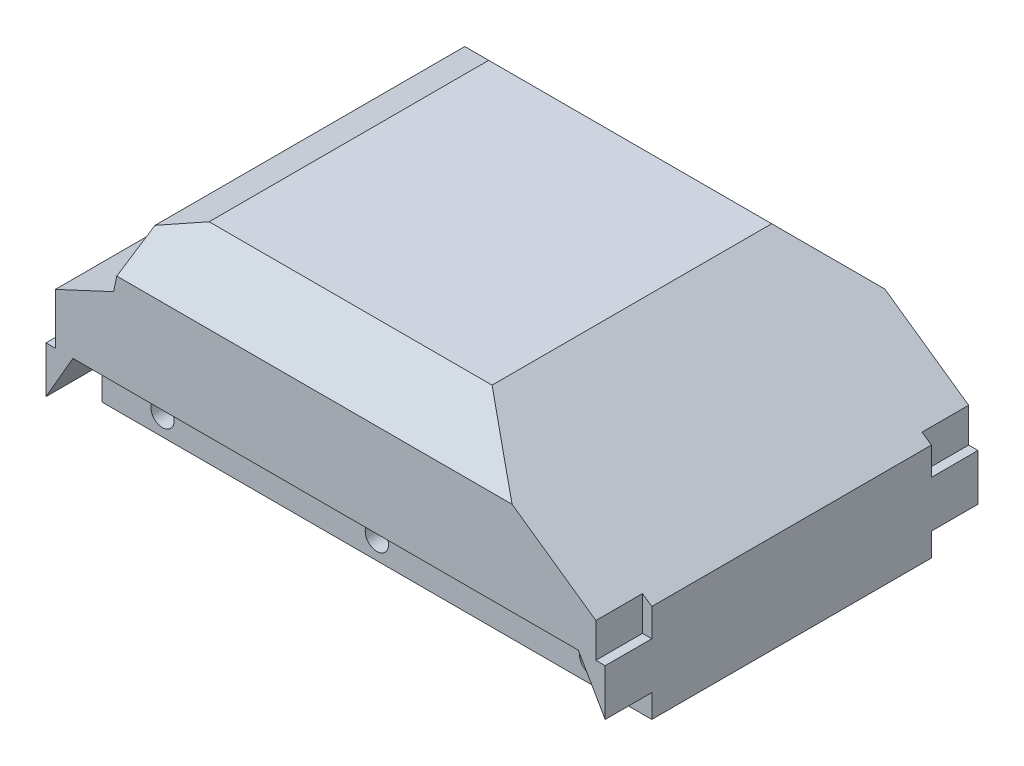
ISO-10303-21;
HEADER;
FILE_DESCRIPTION(('STEP AP214'),'2;1');
FILE_NAME('part.step','',(''),(''),'','','');
FILE_SCHEMA(('AUTOMOTIVE_DESIGN { 1 0 10303 214 1 1 1 1 }'));
ENDSEC;
DATA;
#1=APPLICATION_CONTEXT('core data for automotive mechanical design processes');
#2=APPLICATION_PROTOCOL_DEFINITION('international standard','automotive_design',2000,#1);
#3=PRODUCT_CONTEXT('',#1,'mechanical');
#4=PRODUCT('Part','Part','',(#3));
#5=PRODUCT_RELATED_PRODUCT_CATEGORY('part','',(#4));
#6=PRODUCT_DEFINITION_FORMATION('','',#4);
#7=PRODUCT_DEFINITION_CONTEXT('part definition',#1,'design');
#8=PRODUCT_DEFINITION('design','',#6,#7);
#9=PRODUCT_DEFINITION_SHAPE('','',#8);
#10=(LENGTH_UNIT() NAMED_UNIT(*) SI_UNIT(.MILLI.,.METRE.));
#11=(NAMED_UNIT(*) PLANE_ANGLE_UNIT() SI_UNIT($,.RADIAN.));
#12=(NAMED_UNIT(*) SI_UNIT($,.STERADIAN.) SOLID_ANGLE_UNIT());
#13=UNCERTAINTY_MEASURE_WITH_UNIT(LENGTH_MEASURE(1.E-05),#10,'distance_accuracy_value','');
#14=(GEOMETRIC_REPRESENTATION_CONTEXT(3) GLOBAL_UNCERTAINTY_ASSIGNED_CONTEXT((#13)) GLOBAL_UNIT_ASSIGNED_CONTEXT((#10,
#11,#12)) REPRESENTATION_CONTEXT('',''));
#15=CARTESIAN_POINT('',(0.,0.,0.));
#16=DIRECTION('',(0.,0.,1.));
#17=DIRECTION('',(1.,0.,0.));
#18=AXIS2_PLACEMENT_3D('',#15,#16,#17);
#19=CARTESIAN_POINT('',(0.,74.8916505008483,0.));
#20=DIRECTION('',(0.,-1.,0.));
#21=DIRECTION('',(0.,0.,-1.));
#22=AXIS2_PLACEMENT_3D('',#19,#20,#21);
#23=PLANE('',#22);
#24=DIRECTION('',(0.,0.,-1.));
#25=VECTOR('',#24,1.);
#26=CARTESIAN_POINT('',(113.092371629918,74.8916505008483,195.747597125653));
#27=LINE('',#26,#25);
#28=CARTESIAN_POINT('',(113.092371629918,74.8916505008483,92.1829002882369));
#29=VERTEX_POINT('',#28);
#30=CARTESIAN_POINT('',(113.092371629918,74.8916505008483,79.4829002882369));
#31=VERTEX_POINT('',#30);
#32=EDGE_CURVE('E305',#29,#31,#27,.T.);
#33=ORIENTED_EDGE('',*,*,#32,.F.);
#34=DIRECTION('',(1.,0.,0.));
#35=VECTOR('',#34,1.);
#36=CARTESIAN_POINT('',(-29.4352799513737,74.8916505008483,92.1829002882369));
#37=LINE('',#36,#35);
#38=CARTESIAN_POINT('',(-24.6429315326656,74.8916505008483,92.1829002882369));
#39=VERTEX_POINT('',#38);
#40=EDGE_CURVE('E473',#39,#29,#37,.T.);
#41=ORIENTED_EDGE('',*,*,#40,.F.);
#42=DIRECTION('',(0.,0.,-1.));
#43=VECTOR('',#42,1.);
#44=CARTESIAN_POINT('',(-24.6429315326656,74.8916505008483,195.747597125653));
#45=LINE('',#44,#43);
#46=CARTESIAN_POINT('',(-24.6429315326656,74.8916505008483,79.4829002882369));
#47=VERTEX_POINT('',#46);
#48=EDGE_CURVE('E318',#39,#47,#45,.T.);
#49=ORIENTED_EDGE('',*,*,#48,.T.);
#50=DIRECTION('',(-1.,0.,0.));
#51=VECTOR('',#50,1.);
#52=CARTESIAN_POINT('',(-29.4352799513737,74.8916505008483,79.4829002882369));
#53=LINE('',#52,#51);
#54=EDGE_CURVE('E405',#31,#47,#53,.T.);
#55=ORIENTED_EDGE('',*,*,#54,.F.);
#56=EDGE_LOOP('',(#33,#41,#49,#55));
#57=FACE_BOUND('',#56,.T.);
#58=ADVANCED_FACE('F33',(#57),#23,.T.);
#59=CARTESIAN_POINT('',(-24.6429315326656,74.8916505008483,181.082900288237));
#60=VERTEX_POINT('',#59);
#61=CARTESIAN_POINT('',(-24.6429315326656,74.8916505008483,168.382900288237));
#62=VERTEX_POINT('',#61);
#63=EDGE_CURVE('E327',#60,#62,#45,.T.);
#64=ORIENTED_EDGE('',*,*,#63,.T.);
#65=DIRECTION('',(-1.,0.,0.));
#66=VECTOR('',#65,1.);
#67=CARTESIAN_POINT('',(-29.4352799513737,74.8916505008483,168.382900288237));
#68=LINE('',#67,#66);
#69=CARTESIAN_POINT('',(113.092371629918,74.8916505008483,168.382900288237));
#70=VERTEX_POINT('',#69);
#71=EDGE_CURVE('E250',#70,#62,#68,.T.);
#72=ORIENTED_EDGE('',*,*,#71,.F.);
#73=CARTESIAN_POINT('',(113.092371629918,74.8916505008483,181.082900288237));
#74=VERTEX_POINT('',#73);
#75=EDGE_CURVE('E306',#74,#70,#27,.T.);
#76=ORIENTED_EDGE('',*,*,#75,.F.);
#77=DIRECTION('',(1.,0.,0.));
#78=VECTOR('',#77,1.);
#79=CARTESIAN_POINT('',(117.884720048626,74.8916505008483,181.082900288237));
#80=LINE('',#79,#78);
#81=EDGE_CURVE('E390',#60,#74,#80,.T.);
#82=ORIENTED_EDGE('',*,*,#81,.F.);
#83=EDGE_LOOP('',(#64,#72,#76,#82));
#84=FACE_BOUND('',#83,.T.);
#85=ADVANCED_FACE('F499',(#84),#23,.T.);
#86=CARTESIAN_POINT('',(-31.9752799513737,62.1916505008483,195.747597125653));
#87=DIRECTION('',(-0.866025403784442,0.499999999999995,0.));
#88=DIRECTION('',(-0.499999999999995,-0.866025403784442,0.));
#89=AXIS2_PLACEMENT_3D('',#86,#87,#88);
#90=PLANE('',#89);
#91=DIRECTION('',(0.499999999999995,0.866025403784442,0.));
#92=VECTOR('',#91,1.);
#93=CARTESIAN_POINT('',(-31.9752799513737,62.1916505008483,92.1829002882369));
#94=LINE('',#93,#92);
#95=CARTESIAN_POINT('',(-29.4352799513737,66.5910595520733,92.1829002882369));
#96=VERTEX_POINT('',#95);
#97=EDGE_CURVE('E50',#96,#39,#94,.T.);
#98=ORIENTED_EDGE('',*,*,#97,.F.);
#99=DIRECTION('',(0.,0.,-1.));
#100=VECTOR('',#99,1.);
#101=CARTESIAN_POINT('',(-29.4352799513737,66.5910595520733,195.747597125653));
#102=LINE('',#101,#100);
#103=CARTESIAN_POINT('',(-29.4352799513737,66.5910595520733,168.382900288237));
#104=VERTEX_POINT('',#103);
#105=EDGE_CURVE('E54',#104,#96,#102,.T.);
#106=ORIENTED_EDGE('',*,*,#105,.F.);
#107=DIRECTION('',(-0.499999999999995,-0.866025403784442,0.));
#108=VECTOR('',#107,1.);
#109=CARTESIAN_POINT('',(-31.9752799513737,62.1916505008483,168.382900288237));
#110=LINE('',#109,#108);
#111=EDGE_CURVE('E253',#62,#104,#110,.T.);
#112=ORIENTED_EDGE('',*,*,#111,.F.);
#113=ORIENTED_EDGE('',*,*,#63,.F.);
#114=DIRECTION('',(-0.499999999999995,-0.866025403784442,0.));
#115=VECTOR('',#114,1.);
#116=CARTESIAN_POINT('',(-31.9752799513737,62.1916505008483,181.082900288237));
#117=LINE('',#116,#115);
#118=CARTESIAN_POINT('',(-31.9752799513737,62.1916505008483,181.082900288237));
#119=VERTEX_POINT('',#118);
#120=EDGE_CURVE('E323',#60,#119,#117,.T.);
#121=ORIENTED_EDGE('',*,*,#120,.T.);
#122=DIRECTION('',(0.,0.,-1.));
#123=VECTOR('',#122,1.);
#124=CARTESIAN_POINT('',(-31.9752799513737,62.1916505008483,195.747597125653));
#125=LINE('',#124,#123);
#126=CARTESIAN_POINT('',(-31.9752799513737,62.1916505008483,79.4829002882369));
#127=VERTEX_POINT('',#126);
#128=EDGE_CURVE('E330',#119,#127,#125,.T.);
#129=ORIENTED_EDGE('',*,*,#128,.T.);
#130=DIRECTION('',(-0.499999999999994,-0.866025403784442,0.));
#131=VECTOR('',#130,1.);
#132=CARTESIAN_POINT('',(-31.9752799513737,62.1916505008483,79.4829002882369));
#133=LINE('',#132,#131);
#134=EDGE_CURVE('E298',#47,#127,#133,.T.);
#135=ORIENTED_EDGE('',*,*,#134,.F.);
#136=ORIENTED_EDGE('',*,*,#48,.F.);
#137=EDGE_LOOP('',(#98,#106,#112,#113,#121,#129,#135,#136));
#138=FACE_BOUND('',#137,.T.);
#139=ADVANCED_FACE('F501',(#138),#90,.F.);
#140=CARTESIAN_POINT('',(120.424720048626,62.1916505008483,195.747597125653));
#141=DIRECTION('',(0.866025403784441,0.499999999999997,0.));
#142=DIRECTION('',(-0.499999999999997,0.866025403784441,0.));
#143=AXIS2_PLACEMENT_3D('',#140,#141,#142);
#144=PLANE('',#143);
#145=DIRECTION('',(0.499999999999997,-0.866025403784441,0.));
#146=VECTOR('',#145,1.);
#147=CARTESIAN_POINT('',(120.424720048626,62.1916505008483,92.1829002882369));
#148=LINE('',#147,#146);
#149=CARTESIAN_POINT('',(120.424720048626,62.1916505008483,92.1829002882369));
#150=VERTEX_POINT('',#149);
#151=EDGE_CURVE('E11',#29,#150,#148,.T.);
#152=ORIENTED_EDGE('',*,*,#151,.F.);
#153=ORIENTED_EDGE('',*,*,#32,.T.);
#154=DIRECTION('',(-0.499999999999997,0.866025403784441,0.));
#155=VECTOR('',#154,1.);
#156=CARTESIAN_POINT('',(120.424720048626,62.1916505008483,79.4829002882369));
#157=LINE('',#156,#155);
#158=CARTESIAN_POINT('',(120.424720048626,62.1916505008483,79.4829002882369));
#159=VERTEX_POINT('',#158);
#160=EDGE_CURVE('E289',#159,#31,#157,.T.);
#161=ORIENTED_EDGE('',*,*,#160,.F.);
#162=DIRECTION('',(0.,0.,-1.));
#163=VECTOR('',#162,1.);
#164=CARTESIAN_POINT('',(120.424720048626,62.1916505008483,195.747597125653));
#165=LINE('',#164,#163);
#166=EDGE_CURVE('E301',#150,#159,#165,.T.);
#167=ORIENTED_EDGE('',*,*,#166,.F.);
#168=EDGE_LOOP('',(#152,#153,#161,#167));
#169=FACE_BOUND('',#168,.T.);
#170=ADVANCED_FACE('F519',(#169),#144,.F.);
#171=DIRECTION('',(-0.499999999999997,0.866025403784441,0.));
#172=VECTOR('',#171,1.);
#173=CARTESIAN_POINT('',(120.424720048626,62.1916505008483,168.382900288237));
#174=LINE('',#173,#172);
#175=CARTESIAN_POINT('',(120.424720048626,62.1916505008483,168.382900288237));
#176=VERTEX_POINT('',#175);
#177=EDGE_CURVE('E42',#176,#70,#174,.T.);
#178=ORIENTED_EDGE('',*,*,#177,.F.);
#179=CARTESIAN_POINT('',(120.424720048626,62.1916505008483,181.082900288237));
#180=VERTEX_POINT('',#179);
#181=EDGE_CURVE('E302',#180,#176,#165,.T.);
#182=ORIENTED_EDGE('',*,*,#181,.F.);
#183=DIRECTION('',(-0.499999999999997,0.866025403784441,0.));
#184=VECTOR('',#183,1.);
#185=CARTESIAN_POINT('',(120.424720048626,62.1916505008483,181.082900288237));
#186=LINE('',#185,#184);
#187=EDGE_CURVE('E293',#180,#74,#186,.T.);
#188=ORIENTED_EDGE('',*,*,#187,.T.);
#189=ORIENTED_EDGE('',*,*,#75,.T.);
#190=EDGE_LOOP('',(#178,#182,#188,#189));
#191=FACE_BOUND('',#190,.T.);
#192=ADVANCED_FACE('F494',(#191),#144,.F.);
#193=CARTESIAN_POINT('',(117.884720048626,112.991650500848,181.082900288237));
#194=DIRECTION('',(0.,0.,-1.));
#195=DIRECTION('',(-1.,0.,0.));
#196=AXIS2_PLACEMENT_3D('',#193,#194,#195);
#197=PLANE('',#196);
#198=DIRECTION('',(0.819152044288995,-0.573576436351041,0.));
#199=VECTOR('',#198,1.);
#200=CARTESIAN_POINT('',(76.8947688031261,112.991650500848,181.082900288237));
#201=LINE('',#200,#199);
#202=CARTESIAN_POINT('',(95.0322484887511,100.291650500848,181.082900288237));
#203=VERTEX_POINT('',#202);
#204=CARTESIAN_POINT('',(117.884720048626,84.2901776479009,181.082900288237));
#205=VERTEX_POINT('',#204);
#206=EDGE_CURVE('E326',#203,#205,#201,.T.);
#207=ORIENTED_EDGE('',*,*,#206,.F.);
#208=DIRECTION('',(1.,0.,0.));
#209=VECTOR('',#208,1.);
#210=CARTESIAN_POINT('',(-31.9752799513737,100.291650500848,181.082900288237));
#211=LINE('',#210,#209);
#212=CARTESIAN_POINT('',(-12.6849887689477,100.291650500848,181.082900288237));
#213=VERTEX_POINT('',#212);
#214=EDGE_CURVE('E267',#213,#203,#211,.T.);
#215=ORIENTED_EDGE('',*,*,#214,.F.);
#216=DIRECTION('',(0.207911690817752,0.978147600733807,0.));
#217=VECTOR('',#216,1.);
#218=CARTESIAN_POINT('',(-13.559105718789,96.1792535794193,181.082900288237));
#219=LINE('',#218,#217);
#220=CARTESIAN_POINT('',(-13.559105718789,96.1792535794193,181.082900288237));
#221=VERTEX_POINT('',#220);
#222=EDGE_CURVE('E340',#221,#213,#219,.T.);
#223=ORIENTED_EDGE('',*,*,#222,.F.);
#224=DIRECTION('',(0.906307787036649,0.422618261740701,0.));
#225=VECTOR('',#224,1.);
#226=CARTESIAN_POINT('',(-31.9752799513737,87.5916505008482,181.082900288237));
#227=LINE('',#226,#225);
#228=CARTESIAN_POINT('',(-29.4352799513737,88.7760719525619,181.082900288237));
#229=VERTEX_POINT('',#228);
#230=EDGE_CURVE('E338',#229,#221,#227,.T.);
#231=ORIENTED_EDGE('',*,*,#230,.F.);
#232=DIRECTION('',(0.,-1.,0.));
#233=VECTOR('',#232,1.);
#234=CARTESIAN_POINT('',(-29.4352799513737,112.991650500848,181.082900288237));
#235=LINE('',#234,#233);
#236=CARTESIAN_POINT('',(-29.4352799513737,74.8916505008483,181.082900288237));
#237=VERTEX_POINT('',#236);
#238=EDGE_CURVE('E418',#229,#237,#235,.T.);
#239=ORIENTED_EDGE('',*,*,#238,.T.);
#240=DIRECTION('',(1.,0.,0.));
#241=VECTOR('',#240,1.);
#242=CARTESIAN_POINT('',(-24.6429315326656,74.8916505008483,181.082900288237));
#243=LINE('',#242,#241);
#244=CARTESIAN_POINT('',(-31.9752799513737,74.8916505008483,181.082900288237));
#245=VERTEX_POINT('',#244);
#246=EDGE_CURVE('E322',#245,#237,#243,.T.);
#247=ORIENTED_EDGE('',*,*,#246,.F.);
#248=DIRECTION('',(0.,1.,0.));
#249=VECTOR('',#248,1.);
#250=CARTESIAN_POINT('',(-31.9752799513737,74.8916505008483,181.082900288237));
#251=LINE('',#250,#249);
#252=EDGE_CURVE('E319',#119,#245,#251,.T.);
#253=ORIENTED_EDGE('',*,*,#252,.F.);
#254=ORIENTED_EDGE('',*,*,#120,.F.);
#255=ORIENTED_EDGE('',*,*,#81,.T.);
#256=ORIENTED_EDGE('',*,*,#187,.F.);
#257=DIRECTION('',(0.,-1.,0.));
#258=VECTOR('',#257,1.);
#259=CARTESIAN_POINT('',(120.424720048626,74.8916505008483,181.082900288237));
#260=LINE('',#259,#258);
#261=CARTESIAN_POINT('',(120.424720048626,74.8916505008483,181.082900288237));
#262=VERTEX_POINT('',#261);
#263=EDGE_CURVE('E296',#262,#180,#260,.T.);
#264=ORIENTED_EDGE('',*,*,#263,.F.);
#265=DIRECTION('',(1.,0.,0.));
#266=VECTOR('',#265,1.);
#267=CARTESIAN_POINT('',(113.092371629918,74.8916505008483,181.082900288237));
#268=LINE('',#267,#266);
#269=CARTESIAN_POINT('',(117.884720048626,74.8916505008483,181.082900288237));
#270=VERTEX_POINT('',#269);
#271=EDGE_CURVE('E295',#270,#262,#268,.T.);
#272=ORIENTED_EDGE('',*,*,#271,.F.);
#273=DIRECTION('',(0.,-1.,0.));
#274=VECTOR('',#273,1.);
#275=CARTESIAN_POINT('',(117.884720048626,112.991650500848,181.082900288237));
#276=LINE('',#275,#274);
#277=EDGE_CURVE('E451',#205,#270,#276,.T.);
#278=ORIENTED_EDGE('',*,*,#277,.F.);
#279=EDGE_LOOP('',(#207,#215,#223,#231,#239,#247,#253,#254,#255,#256,#264,#272,#278));
#280=FACE_BOUND('',#279,.T.);
#281=ADVANCED_FACE('F35',(#280),#197,.F.);
#282=CARTESIAN_POINT('',(117.884720048626,112.991650500848,168.382900288237));
#283=DIRECTION('',(-1.,0.,0.));
#284=DIRECTION('',(0.,0.,1.));
#285=AXIS2_PLACEMENT_3D('',#282,#283,#284);
#286=PLANE('',#285);
#287=DIRECTION('',(0.,-1.,0.));
#288=VECTOR('',#287,1.);
#289=CARTESIAN_POINT('',(117.884720048626,112.991650500848,168.382900288237));
#290=LINE('',#289,#288);
#291=CARTESIAN_POINT('',(117.884720048626,84.2901776479009,168.382900288237));
#292=VERTEX_POINT('',#291);
#293=CARTESIAN_POINT('',(117.884720048626,74.8916505008483,168.382900288237));
#294=VERTEX_POINT('',#293);
#295=EDGE_CURVE('E448',#292,#294,#290,.T.);
#296=ORIENTED_EDGE('',*,*,#295,.F.);
#297=DIRECTION('',(0.,0.,1.));
#298=VECTOR('',#297,1.);
#299=CARTESIAN_POINT('',(117.884720048626,84.2901776479009,168.382900288237));
#300=LINE('',#299,#298);
#301=EDGE_CURVE('E378',#292,#205,#300,.T.);
#302=ORIENTED_EDGE('',*,*,#301,.T.);
#303=ORIENTED_EDGE('',*,*,#277,.T.);
#304=DIRECTION('',(0.,0.,-1.));
#305=VECTOR('',#304,1.);
#306=CARTESIAN_POINT('',(117.884720048626,74.8916505008483,168.382900288237));
#307=LINE('',#306,#305);
#308=EDGE_CURVE('E393',#270,#294,#307,.T.);
#309=ORIENTED_EDGE('',*,*,#308,.T.);
#310=EDGE_LOOP('',(#296,#302,#303,#309));
#311=FACE_BOUND('',#310,.T.);
#312=ADVANCED_FACE('F626',(#311),#286,.F.);
#313=CARTESIAN_POINT('',(120.424720048626,112.991650500848,168.382900288237));
#314=DIRECTION('',(0.,0.,-1.));
#315=DIRECTION('',(-1.,0.,0.));
#316=AXIS2_PLACEMENT_3D('',#313,#314,#315);
#317=PLANE('',#316);
#318=DIRECTION('',(0.,-1.,0.));
#319=VECTOR('',#318,1.);
#320=CARTESIAN_POINT('',(120.424720048626,112.991650500848,168.382900288237));
#321=LINE('',#320,#319);
#322=CARTESIAN_POINT('',(120.424720048626,82.5116505008483,168.382900288237));
#323=VERTEX_POINT('',#322);
#324=CARTESIAN_POINT('',(120.424720048626,74.8916505008483,168.382900288237));
#325=VERTEX_POINT('',#324);
#326=EDGE_CURVE('E445',#323,#325,#321,.T.);
#327=ORIENTED_EDGE('',*,*,#326,.F.);
#328=DIRECTION('',(-0.819152044288995,0.573576436351041,0.));
#329=VECTOR('',#328,1.);
#330=CARTESIAN_POINT('',(106.103804507849,92.5392635165649,168.382900288237));
#331=LINE('',#330,#329);
#332=EDGE_CURVE('E375',#323,#292,#331,.T.);
#333=ORIENTED_EDGE('',*,*,#332,.T.);
#334=ORIENTED_EDGE('',*,*,#295,.T.);
#335=DIRECTION('',(1.,0.,0.));
#336=VECTOR('',#335,1.);
#337=CARTESIAN_POINT('',(120.424720048626,74.8916505008483,168.382900288237));
#338=LINE('',#337,#336);
#339=EDGE_CURVE('E396',#294,#325,#338,.T.);
#340=ORIENTED_EDGE('',*,*,#339,.T.);
#341=EDGE_LOOP('',(#327,#333,#334,#340));
#342=FACE_BOUND('',#341,.T.);
#343=ADVANCED_FACE('F629',(#342),#317,.F.);
#344=CARTESIAN_POINT('',(120.424720048626,112.991650500848,92.1829002882369));
#345=DIRECTION('',(-1.,0.,0.));
#346=DIRECTION('',(0.,0.,1.));
#347=AXIS2_PLACEMENT_3D('',#344,#345,#346);
#348=PLANE('',#347);
#349=ORIENTED_EDGE('',*,*,#326,.T.);
#350=DIRECTION('',(0.,0.,-1.));
#351=VECTOR('',#350,1.);
#352=CARTESIAN_POINT('',(120.424720048626,74.8916505008483,195.747597125653));
#353=LINE('',#352,#351);
#354=EDGE_CURVE('E299',#262,#325,#353,.T.);
#355=ORIENTED_EDGE('',*,*,#354,.F.);
#356=ORIENTED_EDGE('',*,*,#263,.T.);
#357=ORIENTED_EDGE('',*,*,#181,.T.);
#358=DIRECTION('',(0.,1.,0.));
#359=VECTOR('',#358,1.);
#360=CARTESIAN_POINT('',(120.424720048626,55.8416505008483,168.382900288237));
#361=LINE('',#360,#359);
#362=CARTESIAN_POINT('',(120.424720048626,55.8416505008483,168.382900288237));
#363=VERTEX_POINT('',#362);
#364=EDGE_CURVE('E256',#363,#176,#361,.T.);
#365=ORIENTED_EDGE('',*,*,#364,.F.);
#366=DIRECTION('',(0.,0.,1.));
#367=VECTOR('',#366,1.);
#368=CARTESIAN_POINT('',(120.424720048626,55.8416505008483,168.382900288237));
#369=LINE('',#368,#367);
#370=CARTESIAN_POINT('',(120.424720048626,55.8416505008483,92.1829002882369));
#371=VERTEX_POINT('',#370);
#372=EDGE_CURVE('E240',#371,#363,#369,.T.);
#373=ORIENTED_EDGE('',*,*,#372,.F.);
#374=DIRECTION('',(0.,1.,0.));
#375=VECTOR('',#374,1.);
#376=CARTESIAN_POINT('',(120.424720048626,55.8416505008483,92.1829002882369));
#377=LINE('',#376,#375);
#378=EDGE_CURVE('E237',#371,#150,#377,.T.);
#379=ORIENTED_EDGE('',*,*,#378,.T.);
#380=ORIENTED_EDGE('',*,*,#166,.T.);
#381=DIRECTION('',(0.,-1.,0.));
#382=VECTOR('',#381,1.);
#383=CARTESIAN_POINT('',(120.424720048626,74.8916505008483,79.4829002882369));
#384=LINE('',#383,#382);
#385=CARTESIAN_POINT('',(120.424720048626,74.8916505008483,79.4829002882369));
#386=VERTEX_POINT('',#385);
#387=EDGE_CURVE('E284',#386,#159,#384,.T.);
#388=ORIENTED_EDGE('',*,*,#387,.F.);
#389=CARTESIAN_POINT('',(120.424720048626,74.8916505008483,92.1829002882369));
#390=VERTEX_POINT('',#389);
#391=EDGE_CURVE('E292',#390,#386,#353,.T.);
#392=ORIENTED_EDGE('',*,*,#391,.F.);
#393=DIRECTION('',(0.,-1.,0.));
#394=VECTOR('',#393,1.);
#395=CARTESIAN_POINT('',(120.424720048626,112.991650500848,92.1829002882369));
#396=LINE('',#395,#394);
#397=CARTESIAN_POINT('',(120.424720048626,82.5116505008483,92.1829002882369));
#398=VERTEX_POINT('',#397);
#399=EDGE_CURVE('E442',#398,#390,#396,.T.);
#400=ORIENTED_EDGE('',*,*,#399,.F.);
#401=DIRECTION('',(0.,0.,1.));
#402=VECTOR('',#401,1.);
#403=CARTESIAN_POINT('',(120.424720048626,82.5116505008483,79.4829002882369));
#404=LINE('',#403,#402);
#405=EDGE_CURVE('E341',#398,#323,#404,.T.);
#406=ORIENTED_EDGE('',*,*,#405,.T.);
#407=EDGE_LOOP('',(#349,#355,#356,#357,#365,#373,#379,#380,#388,#392,#400,#406));
#408=FACE_BOUND('',#407,.T.);
#409=ADVANCED_FACE('F489',(#408),#348,.F.);
#410=CARTESIAN_POINT('',(117.884720048626,112.991650500848,92.1829002882369));
#411=DIRECTION('',(0.,0.,1.));
#412=DIRECTION('',(1.,0.,0.));
#413=AXIS2_PLACEMENT_3D('',#410,#411,#412);
#414=PLANE('',#413);
#415=DIRECTION('',(0.,-1.,0.));
#416=VECTOR('',#415,1.);
#417=CARTESIAN_POINT('',(117.884720048626,112.991650500848,92.1829002882369));
#418=LINE('',#417,#416);
#419=CARTESIAN_POINT('',(117.884720048626,84.2901776479009,92.1829002882369));
#420=VERTEX_POINT('',#419);
#421=CARTESIAN_POINT('',(117.884720048626,74.8916505008483,92.1829002882369));
#422=VERTEX_POINT('',#421);
#423=EDGE_CURVE('E439',#420,#422,#418,.T.);
#424=ORIENTED_EDGE('',*,*,#423,.F.);
#425=DIRECTION('',(0.819152044288995,-0.573576436351041,0.));
#426=VECTOR('',#425,1.);
#427=CARTESIAN_POINT('',(104.399438925825,93.732673144963,92.1829002882369));
#428=LINE('',#427,#426);
#429=EDGE_CURVE('E372',#420,#398,#428,.T.);
#430=ORIENTED_EDGE('',*,*,#429,.T.);
#431=ORIENTED_EDGE('',*,*,#399,.T.);
#432=DIRECTION('',(-1.,0.,0.));
#433=VECTOR('',#432,1.);
#434=CARTESIAN_POINT('',(117.884720048626,74.8916505008483,92.1829002882369));
#435=LINE('',#434,#433);
#436=EDGE_CURVE('E399',#390,#422,#435,.T.);
#437=ORIENTED_EDGE('',*,*,#436,.T.);
#438=EDGE_LOOP('',(#424,#430,#431,#437));
#439=FACE_BOUND('',#438,.T.);
#440=ADVANCED_FACE('F529',(#439),#414,.F.);
#441=CARTESIAN_POINT('',(117.884720048626,112.991650500848,79.4829002882369));
#442=DIRECTION('',(-1.,0.,0.));
#443=DIRECTION('',(0.,0.,1.));
#444=AXIS2_PLACEMENT_3D('',#441,#442,#443);
#445=PLANE('',#444);
#446=DIRECTION('',(0.,-1.,0.));
#447=VECTOR('',#446,1.);
#448=CARTESIAN_POINT('',(117.884720048626,112.991650500848,79.4829002882369));
#449=LINE('',#448,#447);
#450=CARTESIAN_POINT('',(117.884720048626,84.2901776479009,79.4829002882369));
#451=VERTEX_POINT('',#450);
#452=CARTESIAN_POINT('',(117.884720048626,74.8916505008483,79.4829002882369));
#453=VERTEX_POINT('',#452);
#454=EDGE_CURVE('E436',#451,#453,#449,.T.);
#455=ORIENTED_EDGE('',*,*,#454,.F.);
#456=DIRECTION('',(0.,0.,1.));
#457=VECTOR('',#456,1.);
#458=CARTESIAN_POINT('',(117.884720048626,84.2901776479009,79.4829002882369));
#459=LINE('',#458,#457);
#460=EDGE_CURVE('E354',#451,#420,#459,.T.);
#461=ORIENTED_EDGE('',*,*,#460,.T.);
#462=ORIENTED_EDGE('',*,*,#423,.T.);
#463=DIRECTION('',(0.,0.,-1.));
#464=VECTOR('',#463,1.);
#465=CARTESIAN_POINT('',(117.884720048626,74.8916505008483,79.4829002882369));
#466=LINE('',#465,#464);
#467=EDGE_CURVE('E402',#422,#453,#466,.T.);
#468=ORIENTED_EDGE('',*,*,#467,.T.);
#469=EDGE_LOOP('',(#455,#461,#462,#468));
#470=FACE_BOUND('',#469,.T.);
#471=ADVANCED_FACE('F535',(#470),#445,.F.);
#472=CARTESIAN_POINT('',(-29.4352799513737,112.991650500848,79.4829002882369));
#473=DIRECTION('',(0.,0.,1.));
#474=DIRECTION('',(1.,0.,0.));
#475=AXIS2_PLACEMENT_3D('',#472,#473,#474);
#476=PLANE('',#475);
#477=DIRECTION('',(0.207911690817752,0.978147600733807,0.));
#478=VECTOR('',#477,1.);
#479=CARTESIAN_POINT('',(-13.559105718789,96.1792535794193,79.4829002882369));
#480=LINE('',#479,#478);
#481=CARTESIAN_POINT('',(-13.559105718789,96.1792535794193,79.4829002882369));
#482=VERTEX_POINT('',#481);
#483=CARTESIAN_POINT('',(-12.6849887689477,100.291650500848,79.4829002882369));
#484=VERTEX_POINT('',#483);
#485=EDGE_CURVE('E347',#482,#484,#480,.T.);
#486=ORIENTED_EDGE('',*,*,#485,.T.);
#487=DIRECTION('',(1.,0.,0.));
#488=VECTOR('',#487,1.);
#489=CARTESIAN_POINT('',(-31.9752799513737,100.291650500848,79.4829002882368));
#490=LINE('',#489,#488);
#491=CARTESIAN_POINT('',(95.0322484887513,100.291650500848,79.4829002882368));
#492=VERTEX_POINT('',#491);
#493=EDGE_CURVE('E269',#484,#492,#490,.T.);
#494=ORIENTED_EDGE('',*,*,#493,.T.);
#495=DIRECTION('',(0.819152044288995,-0.573576436351041,0.));
#496=VECTOR('',#495,1.);
#497=CARTESIAN_POINT('',(76.8947688031261,112.991650500848,79.4829002882369));
#498=LINE('',#497,#496);
#499=EDGE_CURVE('E363',#492,#451,#498,.T.);
#500=ORIENTED_EDGE('',*,*,#499,.T.);
#501=ORIENTED_EDGE('',*,*,#454,.T.);
#502=DIRECTION('',(1.,0.,0.));
#503=VECTOR('',#502,1.);
#504=CARTESIAN_POINT('',(113.092371629918,74.8916505008483,79.4829002882369));
#505=LINE('',#504,#503);
#506=EDGE_CURVE('E287',#453,#386,#505,.T.);
#507=ORIENTED_EDGE('',*,*,#506,.T.);
#508=ORIENTED_EDGE('',*,*,#387,.T.);
#509=ORIENTED_EDGE('',*,*,#160,.T.);
#510=ORIENTED_EDGE('',*,*,#54,.T.);
#511=ORIENTED_EDGE('',*,*,#134,.T.);
#512=DIRECTION('',(0.,1.,0.));
#513=VECTOR('',#512,1.);
#514=CARTESIAN_POINT('',(-31.9752799513737,74.8916505008483,79.4829002882369));
#515=LINE('',#514,#513);
#516=CARTESIAN_POINT('',(-31.9752799513737,74.8916505008483,79.4829002882369));
#517=VERTEX_POINT('',#516);
#518=EDGE_CURVE('E315',#127,#517,#515,.T.);
#519=ORIENTED_EDGE('',*,*,#518,.T.);
#520=DIRECTION('',(1.,0.,0.));
#521=VECTOR('',#520,1.);
#522=CARTESIAN_POINT('',(-24.6429315326656,74.8916505008483,79.4829002882369));
#523=LINE('',#522,#521);
#524=CARTESIAN_POINT('',(-29.4352799513737,74.8916505008483,79.4829002882369));
#525=VERTEX_POINT('',#524);
#526=EDGE_CURVE('E312',#517,#525,#523,.T.);
#527=ORIENTED_EDGE('',*,*,#526,.T.);
#528=DIRECTION('',(0.,-1.,0.));
#529=VECTOR('',#528,1.);
#530=CARTESIAN_POINT('',(-29.4352799513737,112.991650500848,79.4829002882369));
#531=LINE('',#530,#529);
#532=CARTESIAN_POINT('',(-29.4352799513737,88.7760719525619,79.4829002882369));
#533=VERTEX_POINT('',#532);
#534=EDGE_CURVE('E433',#533,#525,#531,.T.);
#535=ORIENTED_EDGE('',*,*,#534,.F.);
#536=DIRECTION('',(0.906307787036649,0.422618261740701,0.));
#537=VECTOR('',#536,1.);
#538=CARTESIAN_POINT('',(-31.9752799513737,87.5916505008482,79.4829002882369));
#539=LINE('',#538,#537);
#540=EDGE_CURVE('E344',#533,#482,#539,.T.);
#541=ORIENTED_EDGE('',*,*,#540,.T.);
#542=EDGE_LOOP('',(#486,#494,#500,#501,#507,#508,#509,#510,#511,#519,#527,#535,#541));
#543=FACE_BOUND('',#542,.T.);
#544=ADVANCED_FACE('F512',(#543),#476,.F.);
#545=CARTESIAN_POINT('',(-29.4352799513737,112.991650500848,111.232900288237));
#546=DIRECTION('',(1.,0.,0.));
#547=DIRECTION('',(0.,0.,-1.));
#548=AXIS2_PLACEMENT_3D('',#545,#546,#547);
#549=PLANE('',#548);
#550=DIRECTION('',(0.,-1.,0.));
#551=VECTOR('',#550,1.);
#552=CARTESIAN_POINT('',(-29.4352799513737,112.991650500848,111.232900288237));
#553=LINE('',#552,#551);
#554=CARTESIAN_POINT('',(-29.4352799513737,88.7760719525619,111.232900288237));
#555=VERTEX_POINT('',#554);
#556=CARTESIAN_POINT('',(-29.4352799513737,74.8916505008483,111.232900288237));
#557=VERTEX_POINT('',#556);
#558=EDGE_CURVE('E430',#555,#557,#553,.T.);
#559=ORIENTED_EDGE('',*,*,#558,.F.);
#560=DIRECTION('',(0.,0.,-1.));
#561=VECTOR('',#560,1.);
#562=CARTESIAN_POINT('',(-29.4352799513737,88.7760719525619,111.232900288237));
#563=LINE('',#562,#561);
#564=EDGE_CURVE('E387',#555,#533,#563,.T.);
#565=ORIENTED_EDGE('',*,*,#564,.T.);
#566=ORIENTED_EDGE('',*,*,#534,.T.);
#567=DIRECTION('',(0.,0.,1.));
#568=VECTOR('',#567,1.);
#569=CARTESIAN_POINT('',(-29.4352799513737,74.8916505008483,111.232900288237));
#570=LINE('',#569,#568);
#571=EDGE_CURVE('E408',#525,#557,#570,.T.);
#572=ORIENTED_EDGE('',*,*,#571,.T.);
#573=EDGE_LOOP('',(#559,#565,#566,#572));
#574=FACE_BOUND('',#573,.T.);
#575=ADVANCED_FACE('F542',(#574),#549,.F.);
#576=CARTESIAN_POINT('',(-31.9752799513737,112.991650500848,111.232900288237));
#577=DIRECTION('',(0.,0.,1.));
#578=DIRECTION('',(1.,0.,0.));
#579=AXIS2_PLACEMENT_3D('',#576,#577,#578);
#580=PLANE('',#579);
#581=DIRECTION('',(0.,-1.,0.));
#582=VECTOR('',#581,1.);
#583=CARTESIAN_POINT('',(-31.9752799513737,112.991650500848,111.232900288237));
#584=LINE('',#583,#582);
#585=CARTESIAN_POINT('',(-31.9752799513737,87.5916505008482,111.232900288237));
#586=VERTEX_POINT('',#585);
#587=CARTESIAN_POINT('',(-31.9752799513737,74.8916505008483,111.232900288237));
#588=VERTEX_POINT('',#587);
#589=EDGE_CURVE('E427',#586,#588,#584,.T.);
#590=ORIENTED_EDGE('',*,*,#589,.F.);
#591=DIRECTION('',(0.906307787036649,0.422618261740701,0.));
#592=VECTOR('',#591,1.);
#593=CARTESIAN_POINT('',(-22.2465155237627,92.1282478578292,111.232900288237));
#594=LINE('',#593,#592);
#595=EDGE_CURVE('E384',#586,#555,#594,.T.);
#596=ORIENTED_EDGE('',*,*,#595,.T.);
#597=ORIENTED_EDGE('',*,*,#558,.T.);
#598=DIRECTION('',(-1.,0.,0.));
#599=VECTOR('',#598,1.);
#600=CARTESIAN_POINT('',(-31.9752799513737,74.8916505008483,111.232900288237));
#601=LINE('',#600,#599);
#602=EDGE_CURVE('E410',#557,#588,#601,.T.);
#603=ORIENTED_EDGE('',*,*,#602,.T.);
#604=EDGE_LOOP('',(#590,#596,#597,#603));
#605=FACE_BOUND('',#604,.T.);
#606=ADVANCED_FACE('F564',(#605),#580,.F.);
#607=CARTESIAN_POINT('',(-31.9752799513737,112.991650500848,149.332900288237));
#608=DIRECTION('',(1.,0.,0.));
#609=DIRECTION('',(0.,0.,-1.));
#610=AXIS2_PLACEMENT_3D('',#607,#608,#609);
#611=PLANE('',#610);
#612=DIRECTION('',(0.,-1.,0.));
#613=VECTOR('',#612,1.);
#614=CARTESIAN_POINT('',(-31.9752799513737,112.991650500848,149.332900288237));
#615=LINE('',#614,#613);
#616=CARTESIAN_POINT('',(-31.9752799513737,87.5916505008482,149.332900288237));
#617=VERTEX_POINT('',#616);
#618=CARTESIAN_POINT('',(-31.9752799513737,74.8916505008483,149.332900288237));
#619=VERTEX_POINT('',#618);
#620=EDGE_CURVE('E424',#617,#619,#615,.T.);
#621=ORIENTED_EDGE('',*,*,#620,.F.);
#622=DIRECTION('',(0.,0.,1.));
#623=VECTOR('',#622,1.);
#624=CARTESIAN_POINT('',(-31.9752799513737,87.5916505008482,79.4829002882369));
#625=LINE('',#624,#623);
#626=EDGE_CURVE('E350',#586,#617,#625,.T.);
#627=ORIENTED_EDGE('',*,*,#626,.F.);
#628=ORIENTED_EDGE('',*,*,#589,.T.);
#629=DIRECTION('',(0.,0.,-1.));
#630=VECTOR('',#629,1.);
#631=CARTESIAN_POINT('',(-31.9752799513737,74.8916505008483,195.747597125653));
#632=LINE('',#631,#630);
#633=EDGE_CURVE('E332',#588,#517,#632,.T.);
#634=ORIENTED_EDGE('',*,*,#633,.T.);
#635=ORIENTED_EDGE('',*,*,#518,.F.);
#636=ORIENTED_EDGE('',*,*,#128,.F.);
#637=ORIENTED_EDGE('',*,*,#252,.T.);
#638=EDGE_CURVE('E333',#245,#619,#632,.T.);
#639=ORIENTED_EDGE('',*,*,#638,.T.);
#640=EDGE_LOOP('',(#621,#627,#628,#634,#635,#636,#637,#639));
#641=FACE_BOUND('',#640,.T.);
#642=ADVANCED_FACE('F509',(#641),#611,.F.);
#643=CARTESIAN_POINT('',(-29.4352799513737,112.991650500848,149.332900288237));
#644=DIRECTION('',(0.,0.,-1.));
#645=DIRECTION('',(-1.,0.,0.));
#646=AXIS2_PLACEMENT_3D('',#643,#644,#645);
#647=PLANE('',#646);
#648=DIRECTION('',(0.,-1.,0.));
#649=VECTOR('',#648,1.);
#650=CARTESIAN_POINT('',(-29.4352799513737,112.991650500848,149.332900288237));
#651=LINE('',#650,#649);
#652=CARTESIAN_POINT('',(-29.4352799513737,88.7760719525619,149.332900288237));
#653=VERTEX_POINT('',#652);
#654=CARTESIAN_POINT('',(-29.4352799513737,74.8916505008483,149.332900288237));
#655=VERTEX_POINT('',#654);
#656=EDGE_CURVE('E421',#653,#655,#651,.T.);
#657=ORIENTED_EDGE('',*,*,#656,.F.);
#658=DIRECTION('',(-0.906307787036649,-0.422618261740701,0.));
#659=VECTOR('',#658,1.);
#660=CARTESIAN_POINT('',(-20.1601752594608,93.1011243005903,149.332900288237));
#661=LINE('',#660,#659);
#662=EDGE_CURVE('E381',#653,#617,#661,.T.);
#663=ORIENTED_EDGE('',*,*,#662,.T.);
#664=ORIENTED_EDGE('',*,*,#620,.T.);
#665=DIRECTION('',(1.,0.,0.));
#666=VECTOR('',#665,1.);
#667=CARTESIAN_POINT('',(-29.4352799513737,74.8916505008483,149.332900288237));
#668=LINE('',#667,#666);
#669=EDGE_CURVE('E413',#619,#655,#668,.T.);
#670=ORIENTED_EDGE('',*,*,#669,.T.);
#671=EDGE_LOOP('',(#657,#663,#664,#670));
#672=FACE_BOUND('',#671,.T.);
#673=ADVANCED_FACE('F557',(#672),#647,.F.);
#674=CARTESIAN_POINT('',(-29.4352799513737,112.991650500848,181.082900288237));
#675=DIRECTION('',(1.,0.,0.));
#676=DIRECTION('',(0.,0.,-1.));
#677=AXIS2_PLACEMENT_3D('',#674,#675,#676);
#678=PLANE('',#677);
#679=ORIENTED_EDGE('',*,*,#238,.F.);
#680=DIRECTION('',(0.,0.,-1.));
#681=VECTOR('',#680,1.);
#682=CARTESIAN_POINT('',(-29.4352799513737,88.7760719525619,181.082900288237));
#683=LINE('',#682,#681);
#684=EDGE_CURVE('E454',#229,#653,#683,.T.);
#685=ORIENTED_EDGE('',*,*,#684,.T.);
#686=ORIENTED_EDGE('',*,*,#656,.T.);
#687=DIRECTION('',(0.,0.,1.));
#688=VECTOR('',#687,1.);
#689=CARTESIAN_POINT('',(-29.4352799513737,74.8916505008483,181.082900288237));
#690=LINE('',#689,#688);
#691=EDGE_CURVE('E416',#655,#237,#690,.T.);
#692=ORIENTED_EDGE('',*,*,#691,.T.);
#693=EDGE_LOOP('',(#679,#685,#686,#692));
#694=FACE_BOUND('',#693,.T.);
#695=ADVANCED_FACE('F554',(#694),#678,.F.);
#696=CARTESIAN_POINT('',(0.,112.991650500848,0.));
#697=DIRECTION('',(0.,-1.,0.));
#698=DIRECTION('',(0.,0.,-1.));
#699=AXIS2_PLACEMENT_3D('',#696,#697,#698);
#700=PLANE('',#699);
#701=DIRECTION('',(0.,0.,1.));
#702=VECTOR('',#701,1.);
#703=CARTESIAN_POINT('',(-0.225279951373739,112.991650500848,79.4829002882369));
#704=LINE('',#703,#702);
#705=CARTESIAN_POINT('',(-0.225279951373876,112.991650500848,92.1829002882367));
#706=VERTEX_POINT('',#705);
#707=CARTESIAN_POINT('',(-0.225279951373723,112.991650500848,168.382900288237));
#708=VERTEX_POINT('',#707);
#709=EDGE_CURVE('E351',#706,#708,#704,.T.);
#710=ORIENTED_EDGE('',*,*,#709,.T.);
#711=DIRECTION('',(1.,0.,0.));
#712=VECTOR('',#711,1.);
#713=CARTESIAN_POINT('',(-31.9752799513737,112.991650500848,168.382900288237));
#714=LINE('',#713,#712);
#715=CARTESIAN_POINT('',(76.8947688031261,112.991650500848,168.382900288237));
#716=VERTEX_POINT('',#715);
#717=EDGE_CURVE('E263',#708,#716,#714,.T.);
#718=ORIENTED_EDGE('',*,*,#717,.T.);
#719=DIRECTION('',(0.,0.,1.));
#720=VECTOR('',#719,1.);
#721=CARTESIAN_POINT('',(76.8947688031261,112.991650500848,79.4829002882369));
#722=LINE('',#721,#720);
#723=CARTESIAN_POINT('',(76.8947688031262,112.991650500848,92.1829002882367));
#724=VERTEX_POINT('',#723);
#725=EDGE_CURVE('E365',#724,#716,#722,.T.);
#726=ORIENTED_EDGE('',*,*,#725,.F.);
#727=DIRECTION('',(1.,0.,0.));
#728=VECTOR('',#727,1.);
#729=CARTESIAN_POINT('',(-31.9752799513737,112.991650500848,92.1829002882367));
#730=LINE('',#729,#728);
#731=EDGE_CURVE('E262',#706,#724,#730,.T.);
#732=ORIENTED_EDGE('',*,*,#731,.F.);
#733=EDGE_LOOP('',(#710,#718,#726,#732));
#734=FACE_BOUND('',#733,.T.);
#735=ADVANCED_FACE('F552',(#734),#700,.F.);
#736=CARTESIAN_POINT('',(76.8947688031261,112.991650500848,79.4829002882369));
#737=DIRECTION('',(-0.573576436351041,-0.819152044288995,0.));
#738=DIRECTION('',(0.819152044288995,-0.573576436351041,0.));
#739=AXIS2_PLACEMENT_3D('',#736,#737,#738);
#740=PLANE('',#739);
#741=ORIENTED_EDGE('',*,*,#725,.T.);
#742=DIRECTION('',(0.710564775461636,-0.497542812164521,0.497542812164515));
#743=VECTOR('',#742,1.);
#744=CARTESIAN_POINT('',(45.4653831446544,134.99874326021,146.375807528876));
#745=LINE('',#744,#743);
#746=EDGE_CURVE('E281',#716,#203,#745,.T.);
#747=ORIENTED_EDGE('',*,*,#746,.T.);
#748=ORIENTED_EDGE('',*,*,#206,.T.);
#749=ORIENTED_EDGE('',*,*,#301,.F.);
#750=ORIENTED_EDGE('',*,*,#332,.F.);
#751=ORIENTED_EDGE('',*,*,#405,.F.);
#752=ORIENTED_EDGE('',*,*,#429,.F.);
#753=ORIENTED_EDGE('',*,*,#460,.F.);
#754=ORIENTED_EDGE('',*,*,#499,.F.);
#755=DIRECTION('',(-0.710564775461636,0.497542812164521,0.497542812164515));
#756=VECTOR('',#755,1.);
#757=CARTESIAN_POINT('',(81.3846810400506,109.847780106654,89.0390298940423));
#758=LINE('',#757,#756);
#759=EDGE_CURVE('E275',#492,#724,#758,.T.);
#760=ORIENTED_EDGE('',*,*,#759,.T.);
#761=EDGE_LOOP('',(#741,#747,#748,#749,#750,#751,#752,#753,#754,#760));
#762=FACE_BOUND('',#761,.T.);
#763=ADVANCED_FACE('F532',(#762),#740,.F.);
#764=CARTESIAN_POINT('',(-31.9752799513737,87.5916505008482,79.4829002882369));
#765=DIRECTION('',(0.422618261740701,-0.906307787036649,0.));
#766=DIRECTION('',(0.906307787036649,0.422618261740701,0.));
#767=AXIS2_PLACEMENT_3D('',#764,#765,#766);
#768=PLANE('',#767);
#769=ORIENTED_EDGE('',*,*,#595,.F.);
#770=ORIENTED_EDGE('',*,*,#626,.T.);
#771=ORIENTED_EDGE('',*,*,#662,.F.);
#772=ORIENTED_EDGE('',*,*,#684,.F.);
#773=ORIENTED_EDGE('',*,*,#230,.T.);
#774=DIRECTION('',(0.,0.,1.));
#775=VECTOR('',#774,1.);
#776=CARTESIAN_POINT('',(-13.559105718789,96.1792535794193,79.4829002882369));
#777=LINE('',#776,#775);
#778=EDGE_CURVE('E358',#482,#221,#777,.T.);
#779=ORIENTED_EDGE('',*,*,#778,.F.);
#780=ORIENTED_EDGE('',*,*,#540,.F.);
#781=ORIENTED_EDGE('',*,*,#564,.F.);
#782=EDGE_LOOP('',(#769,#770,#771,#772,#773,#779,#780,#781));
#783=FACE_BOUND('',#782,.T.);
#784=ADVANCED_FACE('F578',(#783),#768,.F.);
#785=CARTESIAN_POINT('',(-10.8596373855798,108.879253579419,79.4829002882369));
#786=DIRECTION('',(0.360679174240507,-0.932689944874065,0.));
#787=DIRECTION('',(0.932689944874065,0.360679174240507,0.));
#788=AXIS2_PLACEMENT_3D('',#785,#786,#787);
#789=PLANE('',#788);
#790=DIRECTION('',(0.,0.,1.));
#791=VECTOR('',#790,1.);
#792=CARTESIAN_POINT('',(-10.8596373855798,108.879253579419,79.4829002882369));
#793=LINE('',#792,#791);
#794=CARTESIAN_POINT('',(-10.8596373855798,108.879253579419,88.0705033668078));
#795=VERTEX_POINT('',#794);
#796=CARTESIAN_POINT('',(-10.8596373855798,108.879253579419,172.495297209666));
#797=VERTEX_POINT('',#796);
#798=EDGE_CURVE('E355',#795,#797,#793,.T.);
#799=ORIENTED_EDGE('',*,*,#798,.T.);
#800=DIRECTION('',(0.877366163224706,0.339284994973519,-0.339284994973515));
#801=VECTOR('',#800,1.);
#802=CARTESIAN_POINT('',(16.8280301029662,119.586311269167,161.788239519918));
#803=LINE('',#802,#801);
#804=EDGE_CURVE('E278',#797,#708,#803,.T.);
#805=ORIENTED_EDGE('',*,*,#804,.T.);
#806=ORIENTED_EDGE('',*,*,#709,.F.);
#807=DIRECTION('',(-0.877366163224706,-0.339284994973519,-0.339284994973515));
#808=VECTOR('',#807,1.);
#809=CARTESIAN_POINT('',(-13.4159708038439,107.890697595247,87.0819473826352));
#810=LINE('',#809,#808);
#811=EDGE_CURVE('E266',#706,#795,#810,.T.);
#812=ORIENTED_EDGE('',*,*,#811,.T.);
#813=EDGE_LOOP('',(#799,#805,#806,#812));
#814=FACE_BOUND('',#813,.T.);
#815=ADVANCED_FACE('F603',(#814),#789,.F.);
#816=CARTESIAN_POINT('',(-13.559105718789,96.1792535794193,79.4829002882369));
#817=DIRECTION('',(0.978147600733807,-0.207911690817752,0.));
#818=DIRECTION('',(0.207911690817752,0.978147600733807,0.));
#819=AXIS2_PLACEMENT_3D('',#816,#817,#818);
#820=PLANE('',#819);
#821=ORIENTED_EDGE('',*,*,#222,.T.);
#822=DIRECTION('',(0.148630766248353,0.69925277808688,-0.699252778086872));
#823=VECTOR('',#822,1.);
#824=CARTESIAN_POINT('',(-2.57236596561975,147.867800227185,133.5067505619));
#825=LINE('',#824,#823);
#826=EDGE_CURVE('E460',#213,#797,#825,.T.);
#827=ORIENTED_EDGE('',*,*,#826,.T.);
#828=ORIENTED_EDGE('',*,*,#798,.F.);
#829=DIRECTION('',(-0.148630766248353,-0.69925277808688,-0.699252778086872));
#830=VECTOR('',#829,1.);
#831=CARTESIAN_POINT('',(-13.1317023483872,98.1900283447043,77.381278132093));
#832=LINE('',#831,#830);
#833=EDGE_CURVE('E457',#795,#484,#832,.T.);
#834=ORIENTED_EDGE('',*,*,#833,.T.);
#835=ORIENTED_EDGE('',*,*,#485,.F.);
#836=ORIENTED_EDGE('',*,*,#778,.T.);
#837=EDGE_LOOP('',(#821,#827,#828,#834,#835,#836));
#838=FACE_BOUND('',#837,.T.);
#839=ADVANCED_FACE('F586',(#838),#820,.F.);
#840=CARTESIAN_POINT('',(-24.6429315326656,74.8916505008483,195.747597125653));
#841=DIRECTION('',(0.,-1.,0.));
#842=DIRECTION('',(0.,0.,-1.));
#843=AXIS2_PLACEMENT_3D('',#840,#841,#842);
#844=PLANE('',#843);
#845=ORIENTED_EDGE('',*,*,#691,.F.);
#846=ORIENTED_EDGE('',*,*,#669,.F.);
#847=ORIENTED_EDGE('',*,*,#638,.F.);
#848=ORIENTED_EDGE('',*,*,#246,.T.);
#849=EDGE_LOOP('',(#845,#846,#847,#848));
#850=FACE_BOUND('',#849,.T.);
#851=ADVANCED_FACE('F592',(#850),#844,.F.);
#852=ORIENTED_EDGE('',*,*,#602,.F.);
#853=ORIENTED_EDGE('',*,*,#571,.F.);
#854=ORIENTED_EDGE('',*,*,#526,.F.);
#855=ORIENTED_EDGE('',*,*,#633,.F.);
#856=EDGE_LOOP('',(#852,#853,#854,#855));
#857=FACE_BOUND('',#856,.T.);
#858=ADVANCED_FACE('F589',(#857),#844,.F.);
#859=CARTESIAN_POINT('',(113.092371629918,74.8916505008483,195.747597125653));
#860=DIRECTION('',(0.,-1.,0.));
#861=DIRECTION('',(0.,0.,-1.));
#862=AXIS2_PLACEMENT_3D('',#859,#860,#861);
#863=PLANE('',#862);
#864=ORIENTED_EDGE('',*,*,#339,.F.);
#865=ORIENTED_EDGE('',*,*,#308,.F.);
#866=ORIENTED_EDGE('',*,*,#271,.T.);
#867=ORIENTED_EDGE('',*,*,#354,.T.);
#868=EDGE_LOOP('',(#864,#865,#866,#867));
#869=FACE_BOUND('',#868,.T.);
#870=ADVANCED_FACE('F591',(#869),#863,.F.);
#871=ORIENTED_EDGE('',*,*,#467,.F.);
#872=ORIENTED_EDGE('',*,*,#436,.F.);
#873=ORIENTED_EDGE('',*,*,#391,.T.);
#874=ORIENTED_EDGE('',*,*,#506,.F.);
#875=EDGE_LOOP('',(#871,#872,#873,#874));
#876=FACE_BOUND('',#875,.T.);
#877=ADVANCED_FACE('F525',(#876),#863,.F.);
#878=CARTESIAN_POINT('',(-31.9752799513737,112.991650500848,92.1829002882367));
#879=DIRECTION('',(0.,-0.707106781186543,0.707106781186552));
#880=DIRECTION('',(0.,-0.707106781186552,-0.707106781186543));
#881=AXIS2_PLACEMENT_3D('',#878,#879,#880);
#882=PLANE('',#881);
#883=ORIENTED_EDGE('',*,*,#493,.F.);
#884=ORIENTED_EDGE('',*,*,#833,.F.);
#885=ORIENTED_EDGE('',*,*,#811,.F.);
#886=ORIENTED_EDGE('',*,*,#731,.T.);
#887=ORIENTED_EDGE('',*,*,#759,.F.);
#888=EDGE_LOOP('',(#883,#884,#885,#886,#887));
#889=FACE_BOUND('',#888,.T.);
#890=ADVANCED_FACE('F648',(#889),#882,.F.);
#891=CARTESIAN_POINT('',(-31.9752799513737,112.991650500848,168.382900288237));
#892=DIRECTION('',(0.,-0.707106781186543,-0.707106781186552));
#893=DIRECTION('',(0.,0.707106781186552,-0.707106781186543));
#894=AXIS2_PLACEMENT_3D('',#891,#892,#893);
#895=PLANE('',#894);
#896=ORIENTED_EDGE('',*,*,#717,.F.);
#897=ORIENTED_EDGE('',*,*,#804,.F.);
#898=ORIENTED_EDGE('',*,*,#826,.F.);
#899=ORIENTED_EDGE('',*,*,#214,.T.);
#900=ORIENTED_EDGE('',*,*,#746,.F.);
#901=EDGE_LOOP('',(#896,#897,#898,#899,#900));
#902=FACE_BOUND('',#901,.T.);
#903=ADVANCED_FACE('F621',(#902),#895,.F.);
#904=CARTESIAN_POINT('',(-29.4352799513737,55.8416505008483,168.382900288237));
#905=DIRECTION('',(1.,0.,0.));
#906=DIRECTION('',(0.,0.,-1.));
#907=AXIS2_PLACEMENT_3D('',#904,#905,#906);
#908=PLANE('',#907);
#909=DIRECTION('',(0.,1.,0.));
#910=VECTOR('',#909,1.);
#911=CARTESIAN_POINT('',(-29.4352799513737,55.8416505008483,168.382900288237));
#912=LINE('',#911,#910);
#913=CARTESIAN_POINT('',(-29.4352799513737,55.8416505008483,168.382900288237));
#914=VERTEX_POINT('',#913);
#915=EDGE_CURVE('E483',#914,#104,#912,.T.);
#916=ORIENTED_EDGE('',*,*,#915,.T.);
#917=ORIENTED_EDGE('',*,*,#105,.T.);
#918=DIRECTION('',(0.,1.,0.));
#919=VECTOR('',#918,1.);
#920=CARTESIAN_POINT('',(-29.4352799513737,55.8416505008483,92.1829002882369));
#921=LINE('',#920,#919);
#922=CARTESIAN_POINT('',(-29.4352799513737,55.8416505008483,92.1829002882369));
#923=VERTEX_POINT('',#922);
#924=EDGE_CURVE('E235',#923,#96,#921,.T.);
#925=ORIENTED_EDGE('',*,*,#924,.F.);
#926=DIRECTION('',(0.,0.,-1.));
#927=VECTOR('',#926,1.);
#928=CARTESIAN_POINT('',(-29.4352799513737,55.8416505008483,168.382900288237));
#929=LINE('',#928,#927);
#930=EDGE_CURVE('E241',#914,#923,#929,.T.);
#931=ORIENTED_EDGE('',*,*,#930,.F.);
#932=EDGE_LOOP('',(#916,#917,#925,#931));
#933=FACE_BOUND('',#932,.T.);
#934=ADVANCED_FACE('F252',(#933),#908,.F.);
#935=CARTESIAN_POINT('',(-29.4352799513737,55.8416505008483,92.1829002882369));
#936=DIRECTION('',(0.,0.,1.));
#937=DIRECTION('',(1.,0.,0.));
#938=AXIS2_PLACEMENT_3D('',#935,#936,#937);
#939=PLANE('',#938);
#940=CARTESIAN_POINT('',(103.914720048626,61.2163550264608,92.1829002882369));
#941=DIRECTION('',(0.,0.,-1.));
#942=DIRECTION('',(-1.,0.,0.));
#943=AXIS2_PLACEMENT_3D('',#940,#941,#942);
#944=CIRCLE('',#943,3.175);
#945=CARTESIAN_POINT('',(100.739720048626,61.2163550264608,92.1829002882369));
#946=VERTEX_POINT('',#945);
#947=EDGE_CURVE('E468',#946,#946,#944,.T.);
#948=ORIENTED_EDGE('',*,*,#947,.F.);
#949=EDGE_LOOP('',(#948));
#950=FACE_BOUND('',#949,.T.);
#951=CARTESIAN_POINT('',(45.4947200486263,61.2163550264608,92.1829002882369));
#952=DIRECTION('',(0.,0.,-1.));
#953=DIRECTION('',(-1.,0.,0.));
#954=AXIS2_PLACEMENT_3D('',#951,#952,#953);
#955=CIRCLE('',#954,3.175);
#956=CARTESIAN_POINT('',(42.3197200486263,61.2163550264608,92.1829002882369));
#957=VERTEX_POINT('',#956);
#958=EDGE_CURVE('E679',#957,#957,#955,.T.);
#959=ORIENTED_EDGE('',*,*,#958,.F.);
#960=EDGE_LOOP('',(#959));
#961=FACE_BOUND('',#960,.T.);
#962=CARTESIAN_POINT('',(-12.9252799513737,61.2163550264608,92.1829002882369));
#963=DIRECTION('',(0.,0.,-1.));
#964=DIRECTION('',(-1.,0.,0.));
#965=AXIS2_PLACEMENT_3D('',#962,#963,#964);
#966=CIRCLE('',#965,3.175);
#967=CARTESIAN_POINT('',(-16.1002799513737,61.2163550264608,92.1829002882369));
#968=VERTEX_POINT('',#967);
#969=EDGE_CURVE('E682',#968,#968,#966,.T.);
#970=ORIENTED_EDGE('',*,*,#969,.F.);
#971=EDGE_LOOP('',(#970));
#972=FACE_BOUND('',#971,.T.);
#973=ORIENTED_EDGE('',*,*,#924,.T.);
#974=ORIENTED_EDGE('',*,*,#97,.T.);
#975=ORIENTED_EDGE('',*,*,#40,.T.);
#976=ORIENTED_EDGE('',*,*,#151,.T.);
#977=ORIENTED_EDGE('',*,*,#378,.F.);
#978=DIRECTION('',(1.,0.,0.));
#979=VECTOR('',#978,1.);
#980=CARTESIAN_POINT('',(-29.4352799513737,55.8416505008483,92.1829002882369));
#981=LINE('',#980,#979);
#982=EDGE_CURVE('E231',#923,#371,#981,.T.);
#983=ORIENTED_EDGE('',*,*,#982,.F.);
#984=EDGE_LOOP('',(#973,#974,#975,#976,#977,#983));
#985=FACE_BOUND('',#984,.T.);
#986=ADVANCED_FACE('F233',(#950,#961,#972,#985),#939,.F.);
#987=CARTESIAN_POINT('',(-29.4352799513737,55.8416505008483,168.382900288237));
#988=DIRECTION('',(0.,0.,-1.));
#989=DIRECTION('',(-1.,0.,0.));
#990=AXIS2_PLACEMENT_3D('',#987,#988,#989);
#991=PLANE('',#990);
#992=CARTESIAN_POINT('',(103.914720048626,61.2163550264608,168.382900288237));
#993=DIRECTION('',(0.,0.,-1.));
#994=DIRECTION('',(-1.,0.,0.));
#995=AXIS2_PLACEMENT_3D('',#992,#993,#994);
#996=CIRCLE('',#995,3.175);
#997=CARTESIAN_POINT('',(100.739720048626,61.2163550264608,168.382900288237));
#998=VERTEX_POINT('',#997);
#999=EDGE_CURVE('E37',#998,#998,#996,.T.);
#1000=ORIENTED_EDGE('',*,*,#999,.T.);
#1001=EDGE_LOOP('',(#1000));
#1002=FACE_BOUND('',#1001,.T.);
#1003=CARTESIAN_POINT('',(45.4947200486263,61.2163550264608,168.382900288237));
#1004=DIRECTION('',(0.,0.,-1.));
#1005=DIRECTION('',(-1.,0.,0.));
#1006=AXIS2_PLACEMENT_3D('',#1003,#1004,#1005);
#1007=CIRCLE('',#1006,3.175);
#1008=CARTESIAN_POINT('',(42.3197200486263,61.2163550264608,168.382900288237));
#1009=VERTEX_POINT('',#1008);
#1010=EDGE_CURVE('E467',#1009,#1009,#1007,.T.);
#1011=ORIENTED_EDGE('',*,*,#1010,.T.);
#1012=EDGE_LOOP('',(#1011));
#1013=FACE_BOUND('',#1012,.T.);
#1014=CARTESIAN_POINT('',(-12.9252799513737,61.2163550264608,168.382900288237));
#1015=DIRECTION('',(0.,0.,-1.));
#1016=DIRECTION('',(-1.,0.,0.));
#1017=AXIS2_PLACEMENT_3D('',#1014,#1015,#1016);
#1018=CIRCLE('',#1017,3.175);
#1019=CARTESIAN_POINT('',(-16.1002799513737,61.2163550264608,168.382900288237));
#1020=VERTEX_POINT('',#1019);
#1021=EDGE_CURVE('E465',#1020,#1020,#1018,.T.);
#1022=ORIENTED_EDGE('',*,*,#1021,.T.);
#1023=EDGE_LOOP('',(#1022));
#1024=FACE_BOUND('',#1023,.T.);
#1025=ORIENTED_EDGE('',*,*,#71,.T.);
#1026=ORIENTED_EDGE('',*,*,#111,.T.);
#1027=ORIENTED_EDGE('',*,*,#915,.F.);
#1028=DIRECTION('',(-1.,0.,0.));
#1029=VECTOR('',#1028,1.);
#1030=CARTESIAN_POINT('',(-29.4352799513737,55.8416505008483,168.382900288237));
#1031=LINE('',#1030,#1029);
#1032=EDGE_CURVE('E246',#363,#914,#1031,.T.);
#1033=ORIENTED_EDGE('',*,*,#1032,.F.);
#1034=ORIENTED_EDGE('',*,*,#364,.T.);
#1035=ORIENTED_EDGE('',*,*,#177,.T.);
#1036=EDGE_LOOP('',(#1025,#1026,#1027,#1033,#1034,#1035));
#1037=FACE_BOUND('',#1036,.T.);
#1038=ADVANCED_FACE('F487',(#1002,#1013,#1024,#1037),#991,.F.);
#1039=CARTESIAN_POINT('',(0.,55.8416505008483,0.));
#1040=DIRECTION('',(0.,-1.,0.));
#1041=DIRECTION('',(0.,0.,-1.));
#1042=AXIS2_PLACEMENT_3D('',#1039,#1040,#1041);
#1043=PLANE('',#1042);
#1044=ORIENTED_EDGE('',*,*,#930,.T.);
#1045=ORIENTED_EDGE('',*,*,#982,.T.);
#1046=ORIENTED_EDGE('',*,*,#372,.T.);
#1047=ORIENTED_EDGE('',*,*,#1032,.T.);
#1048=EDGE_LOOP('',(#1044,#1045,#1046,#1047));
#1049=FACE_BOUND('',#1048,.T.);
#1050=ADVANCED_FACE('F244',(#1049),#1043,.T.);
#1051=CARTESIAN_POINT('',(-12.9252799513737,61.2163550264608,181.082900288237));
#1052=DIRECTION('',(0.,0.,-1.));
#1053=DIRECTION('',(-1.,0.,0.));
#1054=AXIS2_PLACEMENT_3D('',#1051,#1052,#1053);
#1055=CYLINDRICAL_SURFACE('',#1054,3.175);
#1056=ORIENTED_EDGE('',*,*,#969,.T.);
#1057=EDGE_LOOP('',(#1056));
#1058=FACE_BOUND('',#1057,.T.);
#1059=ORIENTED_EDGE('',*,*,#1021,.F.);
#1060=EDGE_LOOP('',(#1059));
#1061=FACE_BOUND('',#1060,.T.);
#1062=ADVANCED_FACE('F663',(#1058,#1061),#1055,.F.);
#1063=CARTESIAN_POINT('',(45.4947200486263,61.2163550264608,181.082900288237));
#1064=DIRECTION('',(0.,0.,-1.));
#1065=DIRECTION('',(-1.,0.,0.));
#1066=AXIS2_PLACEMENT_3D('',#1063,#1064,#1065);
#1067=CYLINDRICAL_SURFACE('',#1066,3.175);
#1068=ORIENTED_EDGE('',*,*,#958,.T.);
#1069=EDGE_LOOP('',(#1068));
#1070=FACE_BOUND('',#1069,.T.);
#1071=ORIENTED_EDGE('',*,*,#1010,.F.);
#1072=EDGE_LOOP('',(#1071));
#1073=FACE_BOUND('',#1072,.T.);
#1074=ADVANCED_FACE('F666',(#1070,#1073),#1067,.F.);
#1075=CARTESIAN_POINT('',(103.914720048626,61.2163550264608,181.082900288237));
#1076=DIRECTION('',(0.,0.,-1.));
#1077=DIRECTION('',(-1.,0.,0.));
#1078=AXIS2_PLACEMENT_3D('',#1075,#1076,#1077);
#1079=CYLINDRICAL_SURFACE('',#1078,3.175);
#1080=ORIENTED_EDGE('',*,*,#947,.T.);
#1081=EDGE_LOOP('',(#1080));
#1082=FACE_BOUND('',#1081,.T.);
#1083=ORIENTED_EDGE('',*,*,#999,.F.);
#1084=EDGE_LOOP('',(#1083));
#1085=FACE_BOUND('',#1084,.T.);
#1086=ADVANCED_FACE('F670',(#1082,#1085),#1079,.F.);
#1087=CLOSED_SHELL('',(#58,#85,#139,#170,#192,#281,#312,#343,#409,#440,#471,#544,#575,#606,#642,
#673,#695,#735,#763,#784,#815,#839,#851,#858,#870,#877,#890,#903,#934,#986,#1038,#1050,#1062,
#1074,#1086));
#1088=MANIFOLD_SOLID_BREP('B2',#1087);
#1089=ADVANCED_BREP_SHAPE_REPRESENTATION('',(#18,#1088),#14);
#1090=SHAPE_DEFINITION_REPRESENTATION(#9,#1089);
ENDSEC;
END-ISO-10303-21;
